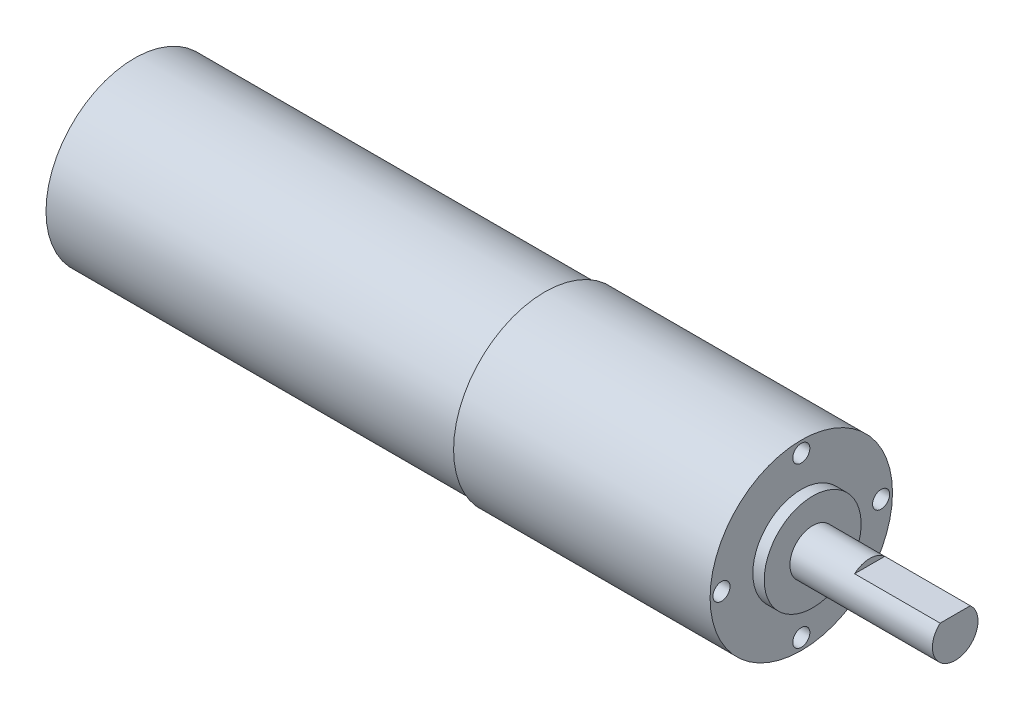
ISO-10303-21;
HEADER;
FILE_DESCRIPTION(('STEP AP214'),'2;1');
FILE_NAME('part.step','',(''),(''),'','','');
FILE_SCHEMA(('AUTOMOTIVE_DESIGN { 1 0 10303 214 1 1 1 1 }'));
ENDSEC;
DATA;
#1=APPLICATION_CONTEXT('core data for automotive mechanical design processes');
#2=APPLICATION_PROTOCOL_DEFINITION('international standard','automotive_design',2000,#1);
#3=PRODUCT_CONTEXT('',#1,'mechanical');
#4=PRODUCT('Part','Part','',(#3));
#5=PRODUCT_RELATED_PRODUCT_CATEGORY('part','',(#4));
#6=PRODUCT_DEFINITION_FORMATION('','',#4);
#7=PRODUCT_DEFINITION_CONTEXT('part definition',#1,'design');
#8=PRODUCT_DEFINITION('design','',#6,#7);
#9=PRODUCT_DEFINITION_SHAPE('','',#8);
#10=(LENGTH_UNIT() NAMED_UNIT(*) SI_UNIT(.MILLI.,.METRE.));
#11=(NAMED_UNIT(*) PLANE_ANGLE_UNIT() SI_UNIT($,.RADIAN.));
#12=(NAMED_UNIT(*) SI_UNIT($,.STERADIAN.) SOLID_ANGLE_UNIT());
#13=UNCERTAINTY_MEASURE_WITH_UNIT(LENGTH_MEASURE(1.E-05),#10,'distance_accuracy_value','');
#14=(GEOMETRIC_REPRESENTATION_CONTEXT(3) GLOBAL_UNCERTAINTY_ASSIGNED_CONTEXT((#13)) GLOBAL_UNIT_ASSIGNED_CONTEXT((#10,
#11,#12)) REPRESENTATION_CONTEXT('',''));
#15=CARTESIAN_POINT('',(0.,0.,0.));
#16=DIRECTION('',(0.,0.,1.));
#17=DIRECTION('',(1.,0.,0.));
#18=AXIS2_PLACEMENT_3D('',#15,#16,#17);
#19=CARTESIAN_POINT('',(0.,0.,0.));
#20=DIRECTION('',(1.,0.,0.));
#21=DIRECTION('',(0.,0.,-1.));
#22=AXIS2_PLACEMENT_3D('',#19,#20,#21);
#23=PLANE('',#22);
#24=CARTESIAN_POINT('',(0.,0.,0.));
#25=DIRECTION('',(-1.,0.,0.));
#26=DIRECTION('',(0.,0.,1.));
#27=AXIS2_PLACEMENT_3D('',#24,#25,#26);
#28=CIRCLE('',#27,15.5);
#29=CARTESIAN_POINT('',(0.,0.,15.5));
#30=VERTEX_POINT('',#29);
#31=EDGE_CURVE('E11',#30,#30,#28,.T.);
#32=ORIENTED_EDGE('',*,*,#31,.T.);
#33=EDGE_LOOP('',(#32));
#34=FACE_BOUND('',#33,.T.);
#35=ADVANCED_FACE('F37',(#34),#23,.F.);
#36=CARTESIAN_POINT('',(0.,0.,0.));
#37=DIRECTION('',(-1.,0.,0.));
#38=DIRECTION('',(0.,0.,1.));
#39=AXIS2_PLACEMENT_3D('',#36,#37,#38);
#40=CYLINDRICAL_SURFACE('',#39,15.5);
#41=ORIENTED_EDGE('',*,*,#31,.F.);
#42=EDGE_LOOP('',(#41));
#43=FACE_BOUND('',#42,.T.);
#44=CARTESIAN_POINT('',(72.,0.,0.));
#45=DIRECTION('',(-1.,0.,0.));
#46=DIRECTION('',(0.,0.,1.));
#47=AXIS2_PLACEMENT_3D('',#44,#45,#46);
#48=CIRCLE('',#47,15.5);
#49=CARTESIAN_POINT('',(72.,0.,15.5));
#50=VERTEX_POINT('',#49);
#51=EDGE_CURVE('E44',#50,#50,#48,.T.);
#52=ORIENTED_EDGE('',*,*,#51,.T.);
#53=EDGE_LOOP('',(#52));
#54=FACE_BOUND('',#53,.T.);
#55=ADVANCED_FACE('F97',(#43,#54),#40,.T.);
#56=CARTESIAN_POINT('',(72.,15.5,0.));
#57=DIRECTION('',(1.,0.,0.));
#58=DIRECTION('',(0.,0.,-1.));
#59=AXIS2_PLACEMENT_3D('',#56,#57,#58);
#60=PLANE('',#59);
#61=ORIENTED_EDGE('',*,*,#51,.F.);
#62=EDGE_LOOP('',(#61));
#63=FACE_BOUND('',#62,.T.);
#64=CARTESIAN_POINT('',(72.,0.,0.));
#65=DIRECTION('',(-1.,0.,0.));
#66=DIRECTION('',(0.,0.,1.));
#67=AXIS2_PLACEMENT_3D('',#64,#65,#66);
#68=CIRCLE('',#67,16.);
#69=CARTESIAN_POINT('',(72.,0.,16.));
#70=VERTEX_POINT('',#69);
#71=EDGE_CURVE('E92',#70,#70,#68,.T.);
#72=ORIENTED_EDGE('',*,*,#71,.T.);
#73=EDGE_LOOP('',(#72));
#74=FACE_BOUND('',#73,.T.);
#75=ADVANCED_FACE('F99',(#63,#74),#60,.F.);
#76=CARTESIAN_POINT('',(0.,0.,0.));
#77=DIRECTION('',(-1.,0.,0.));
#78=DIRECTION('',(0.,0.,1.));
#79=AXIS2_PLACEMENT_3D('',#76,#77,#78);
#80=CYLINDRICAL_SURFACE('',#79,16.);
#81=ORIENTED_EDGE('',*,*,#71,.F.);
#82=EDGE_LOOP('',(#81));
#83=FACE_BOUND('',#82,.T.);
#84=CARTESIAN_POINT('',(117.,0.,0.));
#85=DIRECTION('',(-1.,0.,0.));
#86=DIRECTION('',(0.,0.,1.));
#87=AXIS2_PLACEMENT_3D('',#84,#85,#86);
#88=CIRCLE('',#87,16.);
#89=CARTESIAN_POINT('',(117.,0.,16.));
#90=VERTEX_POINT('',#89);
#91=EDGE_CURVE('E89',#90,#90,#88,.T.);
#92=ORIENTED_EDGE('',*,*,#91,.T.);
#93=EDGE_LOOP('',(#92));
#94=FACE_BOUND('',#93,.T.);
#95=ADVANCED_FACE('F102',(#83,#94),#80,.T.);
#96=CARTESIAN_POINT('',(117.,16.,0.));
#97=DIRECTION('',(-1.,0.,0.));
#98=DIRECTION('',(0.,0.,1.));
#99=AXIS2_PLACEMENT_3D('',#96,#97,#98);
#100=PLANE('',#99);
#101=CARTESIAN_POINT('',(117.,14.,0.));
#102=DIRECTION('',(1.,0.,0.));
#103=DIRECTION('',(0.,0.,-1.));
#104=AXIS2_PLACEMENT_3D('',#101,#102,#103);
#105=CIRCLE('',#104,1.5);
#106=CARTESIAN_POINT('',(117.,14.,-1.5));
#107=VERTEX_POINT('',#106);
#108=EDGE_CURVE('E278',#107,#107,#105,.T.);
#109=ORIENTED_EDGE('',*,*,#108,.F.);
#110=EDGE_LOOP('',(#109));
#111=FACE_BOUND('',#110,.T.);
#112=CARTESIAN_POINT('',(117.,0.,-14.));
#113=DIRECTION('',(1.,0.,0.));
#114=DIRECTION('',(0.,0.,-1.));
#115=AXIS2_PLACEMENT_3D('',#112,#113,#114);
#116=CIRCLE('',#115,1.50000000000011);
#117=CARTESIAN_POINT('',(117.,0.,-15.5000000000001));
#118=VERTEX_POINT('',#117);
#119=EDGE_CURVE('E286',#118,#118,#116,.T.);
#120=ORIENTED_EDGE('',*,*,#119,.F.);
#121=EDGE_LOOP('',(#120));
#122=FACE_BOUND('',#121,.T.);
#123=CARTESIAN_POINT('',(117.,-14.,0.));
#124=DIRECTION('',(1.,0.,0.));
#125=DIRECTION('',(0.,0.,-1.));
#126=AXIS2_PLACEMENT_3D('',#123,#124,#125);
#127=CIRCLE('',#126,1.50000000000049);
#128=CARTESIAN_POINT('',(117.,-14.,-1.5000000000005));
#129=VERTEX_POINT('',#128);
#130=EDGE_CURVE('E292',#129,#129,#127,.T.);
#131=ORIENTED_EDGE('',*,*,#130,.F.);
#132=EDGE_LOOP('',(#131));
#133=FACE_BOUND('',#132,.T.);
#134=CARTESIAN_POINT('',(117.,0.,14.));
#135=DIRECTION('',(1.,0.,0.));
#136=DIRECTION('',(0.,0.,-1.));
#137=AXIS2_PLACEMENT_3D('',#134,#135,#136);
#138=CIRCLE('',#137,1.50000000000038);
#139=CARTESIAN_POINT('',(117.,0.,12.4999999999996));
#140=VERTEX_POINT('',#139);
#141=EDGE_CURVE('E298',#140,#140,#138,.T.);
#142=ORIENTED_EDGE('',*,*,#141,.F.);
#143=EDGE_LOOP('',(#142));
#144=FACE_BOUND('',#143,.T.);
#145=ORIENTED_EDGE('',*,*,#91,.F.);
#146=EDGE_LOOP('',(#145));
#147=FACE_BOUND('',#146,.T.);
#148=CARTESIAN_POINT('',(117.,0.,0.));
#149=DIRECTION('',(-1.,0.,0.));
#150=DIRECTION('',(0.,0.,1.));
#151=AXIS2_PLACEMENT_3D('',#148,#149,#150);
#152=CIRCLE('',#151,8.5);
#153=CARTESIAN_POINT('',(117.,0.,8.5));
#154=VERTEX_POINT('',#153);
#155=EDGE_CURVE('E86',#154,#154,#152,.T.);
#156=ORIENTED_EDGE('',*,*,#155,.T.);
#157=EDGE_LOOP('',(#156));
#158=FACE_BOUND('',#157,.T.);
#159=ADVANCED_FACE('F108',(#111,#122,#133,#144,#147,#158),#100,.F.);
#160=CARTESIAN_POINT('',(0.,0.,0.));
#161=DIRECTION('',(-1.,0.,0.));
#162=DIRECTION('',(0.,0.,1.));
#163=AXIS2_PLACEMENT_3D('',#160,#161,#162);
#164=CYLINDRICAL_SURFACE('',#163,8.5);
#165=ORIENTED_EDGE('',*,*,#155,.F.);
#166=EDGE_LOOP('',(#165));
#167=FACE_BOUND('',#166,.T.);
#168=CARTESIAN_POINT('',(119.,0.,0.));
#169=DIRECTION('',(-1.,0.,0.));
#170=DIRECTION('',(0.,0.,1.));
#171=AXIS2_PLACEMENT_3D('',#168,#169,#170);
#172=CIRCLE('',#171,8.5);
#173=CARTESIAN_POINT('',(119.,0.,8.5));
#174=VERTEX_POINT('',#173);
#175=EDGE_CURVE('E80',#174,#174,#172,.T.);
#176=ORIENTED_EDGE('',*,*,#175,.T.);
#177=EDGE_LOOP('',(#176));
#178=FACE_BOUND('',#177,.T.);
#179=ADVANCED_FACE('F114',(#167,#178),#164,.T.);
#180=CARTESIAN_POINT('',(119.,8.5,0.));
#181=DIRECTION('',(-1.,0.,0.));
#182=DIRECTION('',(0.,0.,1.));
#183=AXIS2_PLACEMENT_3D('',#180,#181,#182);
#184=PLANE('',#183);
#185=ORIENTED_EDGE('',*,*,#175,.F.);
#186=EDGE_LOOP('',(#185));
#187=FACE_BOUND('',#186,.T.);
#188=CARTESIAN_POINT('',(119.,0.,0.));
#189=DIRECTION('',(-1.,0.,0.));
#190=DIRECTION('',(0.,0.,1.));
#191=AXIS2_PLACEMENT_3D('',#188,#189,#190);
#192=CIRCLE('',#191,4.);
#193=CARTESIAN_POINT('',(119.,0.,4.));
#194=VERTEX_POINT('',#193);
#195=EDGE_CURVE('E77',#194,#194,#192,.T.);
#196=ORIENTED_EDGE('',*,*,#195,.T.);
#197=EDGE_LOOP('',(#196));
#198=FACE_BOUND('',#197,.T.);
#199=ADVANCED_FACE('F121',(#187,#198),#184,.F.);
#200=CARTESIAN_POINT('',(0.,0.,0.));
#201=DIRECTION('',(-1.,0.,0.));
#202=DIRECTION('',(0.,0.,1.));
#203=AXIS2_PLACEMENT_3D('',#200,#201,#202);
#204=CYLINDRICAL_SURFACE('',#203,4.);
#205=CARTESIAN_POINT('',(144.,0.,0.));
#206=DIRECTION('',(-1.,0.,0.));
#207=DIRECTION('',(0.,0.,1.));
#208=AXIS2_PLACEMENT_3D('',#205,#206,#207);
#209=CIRCLE('',#208,4.);
#210=CARTESIAN_POINT('',(144.,3.,-2.64575131106459));
#211=VERTEX_POINT('',#210);
#212=CARTESIAN_POINT('',(144.,3.,2.64575131106459));
#213=VERTEX_POINT('',#212);
#214=EDGE_CURVE('E74',#211,#213,#209,.T.);
#215=ORIENTED_EDGE('',*,*,#214,.T.);
#216=DIRECTION('',(1.,0.,0.));
#217=VECTOR('',#216,1.);
#218=CARTESIAN_POINT('',(129.,3.,2.64575131106459));
#219=LINE('',#218,#217);
#220=CARTESIAN_POINT('',(129.,3.,2.64575131106459));
#221=VERTEX_POINT('',#220);
#222=EDGE_CURVE('E51',#221,#213,#219,.T.);
#223=ORIENTED_EDGE('',*,*,#222,.F.);
#224=CARTESIAN_POINT('',(129.,0.,0.));
#225=DIRECTION('',(1.,0.,0.));
#226=DIRECTION('',(0.,0.,-1.));
#227=AXIS2_PLACEMENT_3D('',#224,#225,#226);
#228=CIRCLE('',#227,4.);
#229=CARTESIAN_POINT('',(129.,3.,-2.64575131106459));
#230=VERTEX_POINT('',#229);
#231=EDGE_CURVE('E67',#230,#221,#228,.T.);
#232=ORIENTED_EDGE('',*,*,#231,.F.);
#233=DIRECTION('',(1.,0.,0.));
#234=VECTOR('',#233,1.);
#235=CARTESIAN_POINT('',(129.,3.,-2.64575131106459));
#236=LINE('',#235,#234);
#237=EDGE_CURVE('E57',#230,#211,#236,.T.);
#238=ORIENTED_EDGE('',*,*,#237,.T.);
#239=EDGE_LOOP('',(#215,#223,#232,#238));
#240=FACE_BOUND('',#239,.T.);
#241=ORIENTED_EDGE('',*,*,#195,.F.);
#242=EDGE_LOOP('',(#241));
#243=FACE_BOUND('',#242,.T.);
#244=ADVANCED_FACE('F72',(#240,#243),#204,.T.);
#245=CARTESIAN_POINT('',(144.,4.,0.));
#246=DIRECTION('',(-1.,0.,0.));
#247=DIRECTION('',(0.,0.,1.));
#248=AXIS2_PLACEMENT_3D('',#245,#246,#247);
#249=PLANE('',#248);
#250=ORIENTED_EDGE('',*,*,#214,.F.);
#251=DIRECTION('',(0.,0.,-1.));
#252=VECTOR('',#251,1.);
#253=CARTESIAN_POINT('',(144.,3.,2.64575131106459));
#254=LINE('',#253,#252);
#255=EDGE_CURVE('E62',#213,#211,#254,.T.);
#256=ORIENTED_EDGE('',*,*,#255,.F.);
#257=EDGE_LOOP('',(#250,#256));
#258=FACE_BOUND('',#257,.T.);
#259=ADVANCED_FACE('F76',(#258),#249,.F.);
#260=CARTESIAN_POINT('',(129.,3.,2.64575131106459));
#261=DIRECTION('',(0.,-1.,0.));
#262=DIRECTION('',(0.,0.,-1.));
#263=AXIS2_PLACEMENT_3D('',#260,#261,#262);
#264=PLANE('',#263);
#265=ORIENTED_EDGE('',*,*,#255,.T.);
#266=ORIENTED_EDGE('',*,*,#237,.F.);
#267=DIRECTION('',(0.,0.,-1.));
#268=VECTOR('',#267,1.);
#269=CARTESIAN_POINT('',(129.,3.,2.64575131106459));
#270=LINE('',#269,#268);
#271=EDGE_CURVE('E302',#221,#230,#270,.T.);
#272=ORIENTED_EDGE('',*,*,#271,.F.);
#273=ORIENTED_EDGE('',*,*,#222,.T.);
#274=EDGE_LOOP('',(#265,#266,#272,#273));
#275=FACE_BOUND('',#274,.T.);
#276=ADVANCED_FACE('F63',(#275),#264,.F.);
#277=CARTESIAN_POINT('',(129.,0.,0.));
#278=DIRECTION('',(1.,0.,0.));
#279=DIRECTION('',(0.,0.,-1.));
#280=AXIS2_PLACEMENT_3D('',#277,#278,#279);
#281=PLANE('',#280);
#282=ORIENTED_EDGE('',*,*,#231,.T.);
#283=ORIENTED_EDGE('',*,*,#271,.T.);
#284=EDGE_LOOP('',(#282,#283));
#285=FACE_BOUND('',#284,.T.);
#286=ADVANCED_FACE('F184',(#285),#281,.T.);
#287=CARTESIAN_POINT('',(112.,0.,14.));
#288=DIRECTION('',(1.,0.,0.));
#289=DIRECTION('',(0.,0.,-1.));
#290=AXIS2_PLACEMENT_3D('',#287,#288,#289);
#291=CYLINDRICAL_SURFACE('',#290,1.50000000000038);
#292=CARTESIAN_POINT('',(112.,0.,14.));
#293=DIRECTION('',(1.,0.,0.));
#294=DIRECTION('',(0.,0.,-1.));
#295=AXIS2_PLACEMENT_3D('',#292,#293,#294);
#296=CIRCLE('',#295,1.50000000000038);
#297=CARTESIAN_POINT('',(112.,0.,12.4999999999996));
#298=VERTEX_POINT('',#297);
#299=EDGE_CURVE('E295',#298,#298,#296,.T.);
#300=ORIENTED_EDGE('',*,*,#299,.F.);
#301=EDGE_LOOP('',(#300));
#302=FACE_BOUND('',#301,.T.);
#303=ORIENTED_EDGE('',*,*,#141,.T.);
#304=EDGE_LOOP('',(#303));
#305=FACE_BOUND('',#304,.T.);
#306=ADVANCED_FACE('F192',(#302,#305),#291,.F.);
#307=CARTESIAN_POINT('',(112.,0.,14.));
#308=DIRECTION('',(1.,0.,0.));
#309=DIRECTION('',(0.,0.,-1.));
#310=AXIS2_PLACEMENT_3D('',#307,#308,#309);
#311=PLANE('',#310);
#312=ORIENTED_EDGE('',*,*,#299,.T.);
#313=EDGE_LOOP('',(#312));
#314=FACE_BOUND('',#313,.T.);
#315=ADVANCED_FACE('F202',(#314),#311,.T.);
#316=CARTESIAN_POINT('',(112.,-14.,0.));
#317=DIRECTION('',(1.,0.,0.));
#318=DIRECTION('',(0.,0.,-1.));
#319=AXIS2_PLACEMENT_3D('',#316,#317,#318);
#320=CYLINDRICAL_SURFACE('',#319,1.50000000000049);
#321=CARTESIAN_POINT('',(112.,-14.,0.));
#322=DIRECTION('',(1.,0.,0.));
#323=DIRECTION('',(0.,0.,-1.));
#324=AXIS2_PLACEMENT_3D('',#321,#322,#323);
#325=CIRCLE('',#324,1.50000000000049);
#326=CARTESIAN_POINT('',(112.,-14.,-1.5000000000005));
#327=VERTEX_POINT('',#326);
#328=EDGE_CURVE('E289',#327,#327,#325,.T.);
#329=ORIENTED_EDGE('',*,*,#328,.F.);
#330=EDGE_LOOP('',(#329));
#331=FACE_BOUND('',#330,.T.);
#332=ORIENTED_EDGE('',*,*,#130,.T.);
#333=EDGE_LOOP('',(#332));
#334=FACE_BOUND('',#333,.T.);
#335=ADVANCED_FACE('F209',(#331,#334),#320,.F.);
#336=CARTESIAN_POINT('',(112.,-14.,0.));
#337=DIRECTION('',(1.,0.,0.));
#338=DIRECTION('',(0.,0.,-1.));
#339=AXIS2_PLACEMENT_3D('',#336,#337,#338);
#340=PLANE('',#339);
#341=ORIENTED_EDGE('',*,*,#328,.T.);
#342=EDGE_LOOP('',(#341));
#343=FACE_BOUND('',#342,.T.);
#344=ADVANCED_FACE('F217',(#343),#340,.T.);
#345=CARTESIAN_POINT('',(112.,0.,-14.));
#346=DIRECTION('',(1.,0.,0.));
#347=DIRECTION('',(0.,0.,-1.));
#348=AXIS2_PLACEMENT_3D('',#345,#346,#347);
#349=CYLINDRICAL_SURFACE('',#348,1.50000000000011);
#350=CARTESIAN_POINT('',(112.,0.,-14.));
#351=DIRECTION('',(1.,0.,0.));
#352=DIRECTION('',(0.,0.,-1.));
#353=AXIS2_PLACEMENT_3D('',#350,#351,#352);
#354=CIRCLE('',#353,1.50000000000011);
#355=CARTESIAN_POINT('',(112.,0.,-15.5000000000001));
#356=VERTEX_POINT('',#355);
#357=EDGE_CURVE('E281',#356,#356,#354,.T.);
#358=ORIENTED_EDGE('',*,*,#357,.F.);
#359=EDGE_LOOP('',(#358));
#360=FACE_BOUND('',#359,.T.);
#361=ORIENTED_EDGE('',*,*,#119,.T.);
#362=EDGE_LOOP('',(#361));
#363=FACE_BOUND('',#362,.T.);
#364=ADVANCED_FACE('F225',(#360,#363),#349,.F.);
#365=CARTESIAN_POINT('',(112.,0.,-14.));
#366=DIRECTION('',(1.,0.,0.));
#367=DIRECTION('',(0.,0.,-1.));
#368=AXIS2_PLACEMENT_3D('',#365,#366,#367);
#369=PLANE('',#368);
#370=ORIENTED_EDGE('',*,*,#357,.T.);
#371=EDGE_LOOP('',(#370));
#372=FACE_BOUND('',#371,.T.);
#373=ADVANCED_FACE('F233',(#372),#369,.T.);
#374=CARTESIAN_POINT('',(112.,14.,0.));
#375=DIRECTION('',(1.,0.,0.));
#376=DIRECTION('',(0.,0.,-1.));
#377=AXIS2_PLACEMENT_3D('',#374,#375,#376);
#378=CYLINDRICAL_SURFACE('',#377,1.5);
#379=CARTESIAN_POINT('',(112.,14.,0.));
#380=DIRECTION('',(1.,0.,0.));
#381=DIRECTION('',(0.,0.,-1.));
#382=AXIS2_PLACEMENT_3D('',#379,#380,#381);
#383=CIRCLE('',#382,1.5);
#384=CARTESIAN_POINT('',(112.,14.,-1.5));
#385=VERTEX_POINT('',#384);
#386=EDGE_CURVE('E68',#385,#385,#383,.T.);
#387=ORIENTED_EDGE('',*,*,#386,.F.);
#388=EDGE_LOOP('',(#387));
#389=FACE_BOUND('',#388,.T.);
#390=ORIENTED_EDGE('',*,*,#108,.T.);
#391=EDGE_LOOP('',(#390));
#392=FACE_BOUND('',#391,.T.);
#393=ADVANCED_FACE('F241',(#389,#392),#378,.F.);
#394=CARTESIAN_POINT('',(112.,14.,0.));
#395=DIRECTION('',(1.,0.,0.));
#396=DIRECTION('',(0.,0.,-1.));
#397=AXIS2_PLACEMENT_3D('',#394,#395,#396);
#398=PLANE('',#397);
#399=ORIENTED_EDGE('',*,*,#386,.T.);
#400=EDGE_LOOP('',(#399));
#401=FACE_BOUND('',#400,.T.);
#402=ADVANCED_FACE('F249',(#401),#398,.T.);
#403=CLOSED_SHELL('',(#35,#55,#75,#95,#159,#179,#199,#244,#259,#276,#286,#306,#315,#335,#344,
#364,#373,#393,#402));
#404=MANIFOLD_SOLID_BREP('B2',#403);
#405=ADVANCED_BREP_SHAPE_REPRESENTATION('',(#18,#404),#14);
#406=SHAPE_DEFINITION_REPRESENTATION(#9,#405);
ENDSEC;
END-ISO-10303-21;
